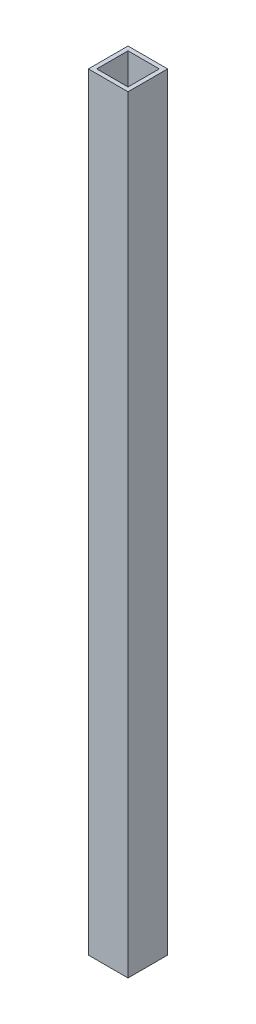
ISO-10303-21;
HEADER;
FILE_DESCRIPTION(('STEP AP214'),'2;1');
FILE_NAME('part.step','',(''),(''),'','','');
FILE_SCHEMA(('AUTOMOTIVE_DESIGN { 1 0 10303 214 1 1 1 1 }'));
ENDSEC;
DATA;
#1=APPLICATION_CONTEXT('core data for automotive mechanical design processes');
#2=APPLICATION_PROTOCOL_DEFINITION('international standard','automotive_design',2000,#1);
#3=PRODUCT_CONTEXT('',#1,'mechanical');
#4=PRODUCT('Part','Part','',(#3));
#5=PRODUCT_RELATED_PRODUCT_CATEGORY('part','',(#4));
#6=PRODUCT_DEFINITION_FORMATION('','',#4);
#7=PRODUCT_DEFINITION_CONTEXT('part definition',#1,'design');
#8=PRODUCT_DEFINITION('design','',#6,#7);
#9=PRODUCT_DEFINITION_SHAPE('','',#8);
#10=(LENGTH_UNIT() NAMED_UNIT(*) SI_UNIT(.MILLI.,.METRE.));
#11=(NAMED_UNIT(*) PLANE_ANGLE_UNIT() SI_UNIT($,.RADIAN.));
#12=(NAMED_UNIT(*) SI_UNIT($,.STERADIAN.) SOLID_ANGLE_UNIT());
#13=UNCERTAINTY_MEASURE_WITH_UNIT(LENGTH_MEASURE(1.E-05),#10,'distance_accuracy_value','');
#14=(GEOMETRIC_REPRESENTATION_CONTEXT(3) GLOBAL_UNCERTAINTY_ASSIGNED_CONTEXT((#13)) GLOBAL_UNIT_ASSIGNED_CONTEXT((#10,
#11,#12)) REPRESENTATION_CONTEXT('',''));
#15=CARTESIAN_POINT('',(0.,0.,0.));
#16=DIRECTION('',(0.,0.,1.));
#17=DIRECTION('',(1.,0.,0.));
#18=AXIS2_PLACEMENT_3D('',#15,#16,#17);
#19=CARTESIAN_POINT('',(0.,368.,0.));
#20=DIRECTION('',(0.,1.,0.));
#21=DIRECTION('',(0.,0.,1.));
#22=AXIS2_PLACEMENT_3D('',#19,#20,#21);
#23=PLANE('',#22);
#24=DIRECTION('',(0.,0.,-1.));
#25=VECTOR('',#24,1.);
#26=CARTESIAN_POINT('',(9.5,368.,9.5));
#27=LINE('',#26,#25);
#28=CARTESIAN_POINT('',(9.5,368.,9.5));
#29=VERTEX_POINT('',#28);
#30=CARTESIAN_POINT('',(9.5,368.,-9.5));
#31=VERTEX_POINT('',#30);
#32=EDGE_CURVE('E181',#29,#31,#27,.T.);
#33=ORIENTED_EDGE('',*,*,#32,.T.);
#34=DIRECTION('',(-1.,0.,0.));
#35=VECTOR('',#34,1.);
#36=CARTESIAN_POINT('',(-9.5,368.,-9.5));
#37=LINE('',#36,#35);
#38=CARTESIAN_POINT('',(-9.5,368.,-9.5));
#39=VERTEX_POINT('',#38);
#40=EDGE_CURVE('E185',#31,#39,#37,.T.);
#41=ORIENTED_EDGE('',*,*,#40,.T.);
#42=DIRECTION('',(0.,0.,1.));
#43=VECTOR('',#42,1.);
#44=CARTESIAN_POINT('',(-9.5,368.,9.5));
#45=LINE('',#44,#43);
#46=CARTESIAN_POINT('',(-9.5,368.,9.5));
#47=VERTEX_POINT('',#46);
#48=EDGE_CURVE('E189',#39,#47,#45,.T.);
#49=ORIENTED_EDGE('',*,*,#48,.T.);
#50=DIRECTION('',(1.,0.,0.));
#51=VECTOR('',#50,1.);
#52=CARTESIAN_POINT('',(-9.5,368.,9.5));
#53=LINE('',#52,#51);
#54=EDGE_CURVE('E192',#47,#29,#53,.T.);
#55=ORIENTED_EDGE('',*,*,#54,.T.);
#56=EDGE_LOOP('',(#33,#41,#49,#55));
#57=FACE_BOUND('',#56,.T.);
#58=DIRECTION('',(-1.,0.,0.));
#59=VECTOR('',#58,1.);
#60=CARTESIAN_POINT('',(0.,368.,-7.5));
#61=LINE('',#60,#59);
#62=CARTESIAN_POINT('',(7.5,368.,-7.5));
#63=VERTEX_POINT('',#62);
#64=CARTESIAN_POINT('',(-7.5,368.,-7.5));
#65=VERTEX_POINT('',#64);
#66=EDGE_CURVE('E142',#63,#65,#61,.T.);
#67=ORIENTED_EDGE('',*,*,#66,.F.);
#68=DIRECTION('',(0.,0.,-1.));
#69=VECTOR('',#68,1.);
#70=CARTESIAN_POINT('',(7.5,368.,0.));
#71=LINE('',#70,#69);
#72=CARTESIAN_POINT('',(7.5,368.,7.5));
#73=VERTEX_POINT('',#72);
#74=EDGE_CURVE('E133',#73,#63,#71,.T.);
#75=ORIENTED_EDGE('',*,*,#74,.F.);
#76=DIRECTION('',(1.,0.,0.));
#77=VECTOR('',#76,1.);
#78=CARTESIAN_POINT('',(0.,368.,7.5));
#79=LINE('',#78,#77);
#80=CARTESIAN_POINT('',(-7.5,368.,7.5));
#81=VERTEX_POINT('',#80);
#82=EDGE_CURVE('E159',#81,#73,#79,.T.);
#83=ORIENTED_EDGE('',*,*,#82,.F.);
#84=DIRECTION('',(0.,0.,1.));
#85=VECTOR('',#84,1.);
#86=CARTESIAN_POINT('',(-7.5,368.,0.));
#87=LINE('',#86,#85);
#88=EDGE_CURVE('E155',#65,#81,#87,.T.);
#89=ORIENTED_EDGE('',*,*,#88,.F.);
#90=EDGE_LOOP('',(#67,#75,#83,#89));
#91=FACE_BOUND('',#90,.T.);
#92=ADVANCED_FACE('F67',(#57,#91),#23,.T.);
#93=CARTESIAN_POINT('',(0.,0.,0.));
#94=DIRECTION('',(0.,1.,0.));
#95=DIRECTION('',(0.,0.,1.));
#96=AXIS2_PLACEMENT_3D('',#93,#94,#95);
#97=PLANE('',#96);
#98=DIRECTION('',(0.,0.,-1.));
#99=VECTOR('',#98,1.);
#100=CARTESIAN_POINT('',(9.5,0.,9.5));
#101=LINE('',#100,#99);
#102=CARTESIAN_POINT('',(9.5,0.,9.5));
#103=VERTEX_POINT('',#102);
#104=CARTESIAN_POINT('',(9.5,0.,-9.5));
#105=VERTEX_POINT('',#104);
#106=EDGE_CURVE('E151',#103,#105,#101,.T.);
#107=ORIENTED_EDGE('',*,*,#106,.F.);
#108=DIRECTION('',(1.,0.,0.));
#109=VECTOR('',#108,1.);
#110=CARTESIAN_POINT('',(-9.5,0.,9.5));
#111=LINE('',#110,#109);
#112=CARTESIAN_POINT('',(-9.5,0.,9.5));
#113=VERTEX_POINT('',#112);
#114=EDGE_CURVE('E186',#113,#103,#111,.T.);
#115=ORIENTED_EDGE('',*,*,#114,.F.);
#116=DIRECTION('',(0.,0.,1.));
#117=VECTOR('',#116,1.);
#118=CARTESIAN_POINT('',(-9.5,0.,9.5));
#119=LINE('',#118,#117);
#120=CARTESIAN_POINT('',(-9.5,0.,-9.5));
#121=VERTEX_POINT('',#120);
#122=EDGE_CURVE('E202',#121,#113,#119,.T.);
#123=ORIENTED_EDGE('',*,*,#122,.F.);
#124=DIRECTION('',(-1.,0.,0.));
#125=VECTOR('',#124,1.);
#126=CARTESIAN_POINT('',(-9.5,0.,-9.5));
#127=LINE('',#126,#125);
#128=EDGE_CURVE('E199',#105,#121,#127,.T.);
#129=ORIENTED_EDGE('',*,*,#128,.F.);
#130=EDGE_LOOP('',(#107,#115,#123,#129));
#131=FACE_BOUND('',#130,.T.);
#132=DIRECTION('',(0.,0.,-1.));
#133=VECTOR('',#132,1.);
#134=CARTESIAN_POINT('',(7.5,0.,0.));
#135=LINE('',#134,#133);
#136=CARTESIAN_POINT('',(7.5,0.,7.5));
#137=VERTEX_POINT('',#136);
#138=CARTESIAN_POINT('',(7.5,0.,-7.5));
#139=VERTEX_POINT('',#138);
#140=EDGE_CURVE('E91',#137,#139,#135,.T.);
#141=ORIENTED_EDGE('',*,*,#140,.T.);
#142=DIRECTION('',(-1.,0.,0.));
#143=VECTOR('',#142,1.);
#144=CARTESIAN_POINT('',(0.,0.,-7.5));
#145=LINE('',#144,#143);
#146=CARTESIAN_POINT('',(-7.5,0.,-7.5));
#147=VERTEX_POINT('',#146);
#148=EDGE_CURVE('E149',#139,#147,#145,.T.);
#149=ORIENTED_EDGE('',*,*,#148,.T.);
#150=DIRECTION('',(0.,0.,1.));
#151=VECTOR('',#150,1.);
#152=CARTESIAN_POINT('',(-7.5,0.,0.));
#153=LINE('',#152,#151);
#154=CARTESIAN_POINT('',(-7.5,0.,7.5));
#155=VERTEX_POINT('',#154);
#156=EDGE_CURVE('E168',#147,#155,#153,.T.);
#157=ORIENTED_EDGE('',*,*,#156,.T.);
#158=DIRECTION('',(1.,0.,0.));
#159=VECTOR('',#158,1.);
#160=CARTESIAN_POINT('',(0.,0.,7.5));
#161=LINE('',#160,#159);
#162=EDGE_CURVE('E143',#155,#137,#161,.T.);
#163=ORIENTED_EDGE('',*,*,#162,.T.);
#164=EDGE_LOOP('',(#141,#149,#157,#163));
#165=FACE_BOUND('',#164,.T.);
#166=ADVANCED_FACE('F225',(#131,#165),#97,.F.);
#167=CARTESIAN_POINT('',(9.5,368.,9.5));
#168=DIRECTION('',(-1.,0.,0.));
#169=DIRECTION('',(0.,0.,1.));
#170=AXIS2_PLACEMENT_3D('',#167,#168,#169);
#171=PLANE('',#170);
#172=ORIENTED_EDGE('',*,*,#106,.T.);
#173=DIRECTION('',(0.,-1.,0.));
#174=VECTOR('',#173,1.);
#175=CARTESIAN_POINT('',(9.5,368.,-9.5));
#176=LINE('',#175,#174);
#177=EDGE_CURVE('E12',#31,#105,#176,.T.);
#178=ORIENTED_EDGE('',*,*,#177,.F.);
#179=ORIENTED_EDGE('',*,*,#32,.F.);
#180=DIRECTION('',(0.,-1.,0.));
#181=VECTOR('',#180,1.);
#182=CARTESIAN_POINT('',(9.5,368.,9.5));
#183=LINE('',#182,#181);
#184=EDGE_CURVE('E195',#29,#103,#183,.T.);
#185=ORIENTED_EDGE('',*,*,#184,.T.);
#186=EDGE_LOOP('',(#172,#178,#179,#185));
#187=FACE_BOUND('',#186,.T.);
#188=ADVANCED_FACE('F69',(#187),#171,.F.);
#189=CARTESIAN_POINT('',(-9.5,368.,-9.5));
#190=DIRECTION('',(0.,0.,1.));
#191=DIRECTION('',(1.,0.,0.));
#192=AXIS2_PLACEMENT_3D('',#189,#190,#191);
#193=PLANE('',#192);
#194=ORIENTED_EDGE('',*,*,#128,.T.);
#195=DIRECTION('',(0.,-1.,0.));
#196=VECTOR('',#195,1.);
#197=CARTESIAN_POINT('',(-9.5,368.,-9.5));
#198=LINE('',#197,#196);
#199=EDGE_CURVE('E76',#39,#121,#198,.T.);
#200=ORIENTED_EDGE('',*,*,#199,.F.);
#201=ORIENTED_EDGE('',*,*,#40,.F.);
#202=ORIENTED_EDGE('',*,*,#177,.T.);
#203=EDGE_LOOP('',(#194,#200,#201,#202));
#204=FACE_BOUND('',#203,.T.);
#205=ADVANCED_FACE('F235',(#204),#193,.F.);
#206=CARTESIAN_POINT('',(-9.5,368.,9.5));
#207=DIRECTION('',(1.,0.,0.));
#208=DIRECTION('',(0.,0.,-1.));
#209=AXIS2_PLACEMENT_3D('',#206,#207,#208);
#210=PLANE('',#209);
#211=ORIENTED_EDGE('',*,*,#122,.T.);
#212=DIRECTION('',(0.,-1.,0.));
#213=VECTOR('',#212,1.);
#214=CARTESIAN_POINT('',(-9.5,368.,9.5));
#215=LINE('',#214,#213);
#216=EDGE_CURVE('E210',#47,#113,#215,.T.);
#217=ORIENTED_EDGE('',*,*,#216,.F.);
#218=ORIENTED_EDGE('',*,*,#48,.F.);
#219=ORIENTED_EDGE('',*,*,#199,.T.);
#220=EDGE_LOOP('',(#211,#217,#218,#219));
#221=FACE_BOUND('',#220,.T.);
#222=ADVANCED_FACE('F219',(#221),#210,.F.);
#223=CARTESIAN_POINT('',(-9.5,368.,9.5));
#224=DIRECTION('',(0.,0.,-1.));
#225=DIRECTION('',(-1.,0.,0.));
#226=AXIS2_PLACEMENT_3D('',#223,#224,#225);
#227=PLANE('',#226);
#228=ORIENTED_EDGE('',*,*,#114,.T.);
#229=ORIENTED_EDGE('',*,*,#184,.F.);
#230=ORIENTED_EDGE('',*,*,#54,.F.);
#231=ORIENTED_EDGE('',*,*,#216,.T.);
#232=EDGE_LOOP('',(#228,#229,#230,#231));
#233=FACE_BOUND('',#232,.T.);
#234=ADVANCED_FACE('F229',(#233),#227,.F.);
#235=CARTESIAN_POINT('',(7.5,368.,0.));
#236=DIRECTION('',(-1.,0.,0.));
#237=DIRECTION('',(0.,0.,1.));
#238=AXIS2_PLACEMENT_3D('',#235,#236,#237);
#239=PLANE('',#238);
#240=ORIENTED_EDGE('',*,*,#140,.F.);
#241=DIRECTION('',(0.,-1.,0.));
#242=VECTOR('',#241,1.);
#243=CARTESIAN_POINT('',(7.5,368.,7.5));
#244=LINE('',#243,#242);
#245=EDGE_CURVE('E137',#73,#137,#244,.T.);
#246=ORIENTED_EDGE('',*,*,#245,.F.);
#247=ORIENTED_EDGE('',*,*,#74,.T.);
#248=DIRECTION('',(0.,-1.,0.));
#249=VECTOR('',#248,1.);
#250=CARTESIAN_POINT('',(7.5,368.,-7.5));
#251=LINE('',#250,#249);
#252=EDGE_CURVE('E136',#63,#139,#251,.T.);
#253=ORIENTED_EDGE('',*,*,#252,.T.);
#254=EDGE_LOOP('',(#240,#246,#247,#253));
#255=FACE_BOUND('',#254,.T.);
#256=ADVANCED_FACE('F135',(#255),#239,.T.);
#257=CARTESIAN_POINT('',(0.,368.,-7.5));
#258=DIRECTION('',(0.,0.,1.));
#259=DIRECTION('',(1.,0.,0.));
#260=AXIS2_PLACEMENT_3D('',#257,#258,#259);
#261=PLANE('',#260);
#262=ORIENTED_EDGE('',*,*,#148,.F.);
#263=ORIENTED_EDGE('',*,*,#252,.F.);
#264=ORIENTED_EDGE('',*,*,#66,.T.);
#265=DIRECTION('',(0.,-1.,0.));
#266=VECTOR('',#265,1.);
#267=CARTESIAN_POINT('',(-7.5,368.,-7.5));
#268=LINE('',#267,#266);
#269=EDGE_CURVE('E152',#65,#147,#268,.T.);
#270=ORIENTED_EDGE('',*,*,#269,.T.);
#271=EDGE_LOOP('',(#262,#263,#264,#270));
#272=FACE_BOUND('',#271,.T.);
#273=ADVANCED_FACE('F146',(#272),#261,.T.);
#274=CARTESIAN_POINT('',(-7.5,368.,0.));
#275=DIRECTION('',(1.,0.,0.));
#276=DIRECTION('',(0.,0.,-1.));
#277=AXIS2_PLACEMENT_3D('',#274,#275,#276);
#278=PLANE('',#277);
#279=ORIENTED_EDGE('',*,*,#156,.F.);
#280=ORIENTED_EDGE('',*,*,#269,.F.);
#281=ORIENTED_EDGE('',*,*,#88,.T.);
#282=DIRECTION('',(0.,-1.,0.));
#283=VECTOR('',#282,1.);
#284=CARTESIAN_POINT('',(-7.5,368.,7.5));
#285=LINE('',#284,#283);
#286=EDGE_CURVE('E83',#81,#155,#285,.T.);
#287=ORIENTED_EDGE('',*,*,#286,.T.);
#288=EDGE_LOOP('',(#279,#280,#281,#287));
#289=FACE_BOUND('',#288,.T.);
#290=ADVANCED_FACE('F258',(#289),#278,.T.);
#291=CARTESIAN_POINT('',(0.,368.,7.5));
#292=DIRECTION('',(0.,0.,-1.));
#293=DIRECTION('',(-1.,0.,0.));
#294=AXIS2_PLACEMENT_3D('',#291,#292,#293);
#295=PLANE('',#294);
#296=ORIENTED_EDGE('',*,*,#162,.F.);
#297=ORIENTED_EDGE('',*,*,#286,.F.);
#298=ORIENTED_EDGE('',*,*,#82,.T.);
#299=ORIENTED_EDGE('',*,*,#245,.T.);
#300=EDGE_LOOP('',(#296,#297,#298,#299));
#301=FACE_BOUND('',#300,.T.);
#302=ADVANCED_FACE('F262',(#301),#295,.T.);
#303=CLOSED_SHELL('',(#92,#166,#188,#205,#222,#234,#256,#273,#290,#302));
#304=MANIFOLD_SOLID_BREP('B2',#303);
#305=ADVANCED_BREP_SHAPE_REPRESENTATION('',(#18,#304),#14);
#306=SHAPE_DEFINITION_REPRESENTATION(#9,#305);
ENDSEC;
END-ISO-10303-21;
